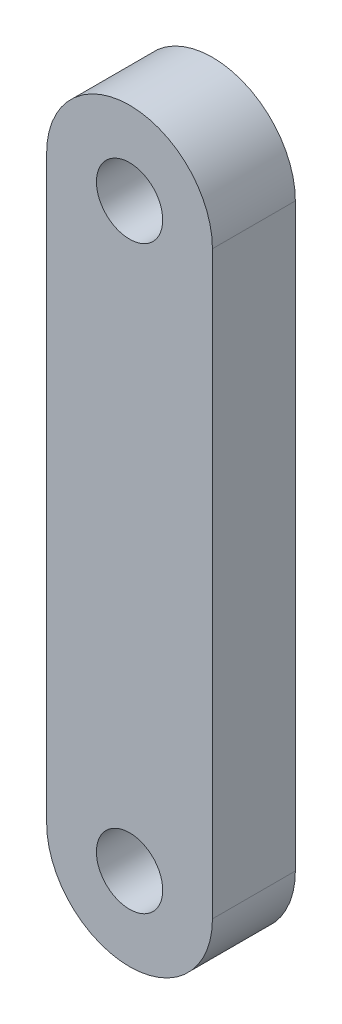
ISO-10303-21;
HEADER;
FILE_DESCRIPTION(('STEP AP214'),'2;1');
FILE_NAME('part.step','',(''),(''),'','','');
FILE_SCHEMA(('AUTOMOTIVE_DESIGN { 1 0 10303 214 1 1 1 1 }'));
ENDSEC;
DATA;
#1=APPLICATION_CONTEXT('core data for automotive mechanical design processes');
#2=APPLICATION_PROTOCOL_DEFINITION('international standard','automotive_design',2000,#1);
#3=PRODUCT_CONTEXT('',#1,'mechanical');
#4=PRODUCT('Part','Part','',(#3));
#5=PRODUCT_RELATED_PRODUCT_CATEGORY('part','',(#4));
#6=PRODUCT_DEFINITION_FORMATION('','',#4);
#7=PRODUCT_DEFINITION_CONTEXT('part definition',#1,'design');
#8=PRODUCT_DEFINITION('design','',#6,#7);
#9=PRODUCT_DEFINITION_SHAPE('','',#8);
#10=(LENGTH_UNIT() NAMED_UNIT(*) SI_UNIT(.MILLI.,.METRE.));
#11=(NAMED_UNIT(*) PLANE_ANGLE_UNIT() SI_UNIT($,.RADIAN.));
#12=(NAMED_UNIT(*) SI_UNIT($,.STERADIAN.) SOLID_ANGLE_UNIT());
#13=UNCERTAINTY_MEASURE_WITH_UNIT(LENGTH_MEASURE(1.E-05),#10,'distance_accuracy_value','');
#14=(GEOMETRIC_REPRESENTATION_CONTEXT(3) GLOBAL_UNCERTAINTY_ASSIGNED_CONTEXT((#13)) GLOBAL_UNIT_ASSIGNED_CONTEXT((#10,
#11,#12)) REPRESENTATION_CONTEXT('',''));
#15=CARTESIAN_POINT('',(0.,0.,0.));
#16=DIRECTION('',(0.,0.,1.));
#17=DIRECTION('',(1.,0.,0.));
#18=AXIS2_PLACEMENT_3D('',#15,#16,#17);
#19=CARTESIAN_POINT('',(0.,17.5,5.));
#20=DIRECTION('',(0.,0.,-1.));
#21=DIRECTION('',(-1.,0.,0.));
#22=AXIS2_PLACEMENT_3D('',#19,#20,#21);
#23=CYLINDRICAL_SURFACE('',#22,5.);
#24=CARTESIAN_POINT('',(0.,17.5,0.));
#25=DIRECTION('',(0.,0.,1.));
#26=DIRECTION('',(1.,0.,0.));
#27=AXIS2_PLACEMENT_3D('',#24,#25,#26);
#28=CIRCLE('',#27,5.);
#29=CARTESIAN_POINT('',(4.99999999999999,17.5,0.));
#30=VERTEX_POINT('',#29);
#31=CARTESIAN_POINT('',(-5.00000000000001,17.5,0.));
#32=VERTEX_POINT('',#31);
#33=EDGE_CURVE('E107',#30,#32,#28,.T.);
#34=ORIENTED_EDGE('',*,*,#33,.T.);
#35=DIRECTION('',(0.,0.,-1.));
#36=VECTOR('',#35,1.);
#37=CARTESIAN_POINT('',(-5.00000000000001,17.5,5.));
#38=LINE('',#37,#36);
#39=CARTESIAN_POINT('',(-5.00000000000001,17.5,5.));
#40=VERTEX_POINT('',#39);
#41=EDGE_CURVE('E11',#40,#32,#38,.T.);
#42=ORIENTED_EDGE('',*,*,#41,.F.);
#43=CARTESIAN_POINT('',(0.,17.5,5.));
#44=DIRECTION('',(0.,0.,1.));
#45=DIRECTION('',(1.,0.,0.));
#46=AXIS2_PLACEMENT_3D('',#43,#44,#45);
#47=CIRCLE('',#46,5.);
#48=CARTESIAN_POINT('',(4.99999999999999,17.5,5.));
#49=VERTEX_POINT('',#48);
#50=EDGE_CURVE('E91',#49,#40,#47,.T.);
#51=ORIENTED_EDGE('',*,*,#50,.F.);
#52=DIRECTION('',(0.,0.,-1.));
#53=VECTOR('',#52,1.);
#54=CARTESIAN_POINT('',(4.99999999999999,17.5,5.));
#55=LINE('',#54,#53);
#56=EDGE_CURVE('E103',#49,#30,#55,.T.);
#57=ORIENTED_EDGE('',*,*,#56,.T.);
#58=EDGE_LOOP('',(#34,#42,#51,#57));
#59=FACE_BOUND('',#58,.T.);
#60=ADVANCED_FACE('F39',(#59),#23,.T.);
#61=CARTESIAN_POINT('',(-5.00000000000001,17.5,5.));
#62=DIRECTION('',(1.,0.,0.));
#63=DIRECTION('',(0.,1.,0.));
#64=AXIS2_PLACEMENT_3D('',#61,#62,#63);
#65=PLANE('',#64);
#66=DIRECTION('',(0.,-1.,0.));
#67=VECTOR('',#66,1.);
#68=CARTESIAN_POINT('',(-5.00000000000001,17.5,0.));
#69=LINE('',#68,#67);
#70=CARTESIAN_POINT('',(-5.,-17.5,0.));
#71=VERTEX_POINT('',#70);
#72=EDGE_CURVE('E96',#32,#71,#69,.T.);
#73=ORIENTED_EDGE('',*,*,#72,.T.);
#74=DIRECTION('',(0.,0.,-1.));
#75=VECTOR('',#74,1.);
#76=CARTESIAN_POINT('',(-5.,-17.5,5.));
#77=LINE('',#76,#75);
#78=CARTESIAN_POINT('',(-5.,-17.5,5.));
#79=VERTEX_POINT('',#78);
#80=EDGE_CURVE('E48',#79,#71,#77,.T.);
#81=ORIENTED_EDGE('',*,*,#80,.F.);
#82=DIRECTION('',(0.,-1.,0.));
#83=VECTOR('',#82,1.);
#84=CARTESIAN_POINT('',(-5.00000000000001,17.5,5.));
#85=LINE('',#84,#83);
#86=EDGE_CURVE('E86',#40,#79,#85,.T.);
#87=ORIENTED_EDGE('',*,*,#86,.F.);
#88=ORIENTED_EDGE('',*,*,#41,.T.);
#89=EDGE_LOOP('',(#73,#81,#87,#88));
#90=FACE_BOUND('',#89,.T.);
#91=ADVANCED_FACE('F95',(#90),#65,.F.);
#92=CARTESIAN_POINT('',(0.,-17.5,5.));
#93=DIRECTION('',(0.,0.,-1.));
#94=DIRECTION('',(-1.,0.,0.));
#95=AXIS2_PLACEMENT_3D('',#92,#93,#94);
#96=CYLINDRICAL_SURFACE('',#95,5.);
#97=CARTESIAN_POINT('',(0.,-17.5,0.));
#98=DIRECTION('',(0.,0.,1.));
#99=DIRECTION('',(1.,0.,0.));
#100=AXIS2_PLACEMENT_3D('',#97,#98,#99);
#101=CIRCLE('',#100,5.);
#102=CARTESIAN_POINT('',(5.,-17.5,0.));
#103=VERTEX_POINT('',#102);
#104=EDGE_CURVE('E73',#71,#103,#101,.T.);
#105=ORIENTED_EDGE('',*,*,#104,.T.);
#106=DIRECTION('',(0.,0.,-1.));
#107=VECTOR('',#106,1.);
#108=CARTESIAN_POINT('',(5.,-17.5,5.));
#109=LINE('',#108,#107);
#110=CARTESIAN_POINT('',(5.,-17.5,5.));
#111=VERTEX_POINT('',#110);
#112=EDGE_CURVE('E98',#111,#103,#109,.T.);
#113=ORIENTED_EDGE('',*,*,#112,.F.);
#114=CARTESIAN_POINT('',(0.,-17.5,5.));
#115=DIRECTION('',(0.,0.,1.));
#116=DIRECTION('',(1.,0.,0.));
#117=AXIS2_PLACEMENT_3D('',#114,#115,#116);
#118=CIRCLE('',#117,5.);
#119=EDGE_CURVE('E89',#79,#111,#118,.T.);
#120=ORIENTED_EDGE('',*,*,#119,.F.);
#121=ORIENTED_EDGE('',*,*,#80,.T.);
#122=EDGE_LOOP('',(#105,#113,#120,#121));
#123=FACE_BOUND('',#122,.T.);
#124=ADVANCED_FACE('F99',(#123),#96,.T.);
#125=CARTESIAN_POINT('',(4.99999999999999,17.5,5.));
#126=DIRECTION('',(-1.,0.,0.));
#127=DIRECTION('',(0.,-1.,0.));
#128=AXIS2_PLACEMENT_3D('',#125,#126,#127);
#129=PLANE('',#128);
#130=DIRECTION('',(0.,1.,0.));
#131=VECTOR('',#130,1.);
#132=CARTESIAN_POINT('',(4.99999999999999,17.5,0.));
#133=LINE('',#132,#131);
#134=EDGE_CURVE('E79',#103,#30,#133,.T.);
#135=ORIENTED_EDGE('',*,*,#134,.T.);
#136=ORIENTED_EDGE('',*,*,#56,.F.);
#137=DIRECTION('',(0.,1.,0.));
#138=VECTOR('',#137,1.);
#139=CARTESIAN_POINT('',(4.99999999999999,17.5,5.));
#140=LINE('',#139,#138);
#141=EDGE_CURVE('E56',#111,#49,#140,.T.);
#142=ORIENTED_EDGE('',*,*,#141,.F.);
#143=ORIENTED_EDGE('',*,*,#112,.T.);
#144=EDGE_LOOP('',(#135,#136,#142,#143));
#145=FACE_BOUND('',#144,.T.);
#146=ADVANCED_FACE('F121',(#145),#129,.F.);
#147=CARTESIAN_POINT('',(0.,17.5,5.));
#148=DIRECTION('',(0.,0.,1.));
#149=DIRECTION('',(1.,0.,0.));
#150=AXIS2_PLACEMENT_3D('',#147,#148,#149);
#151=PLANE('',#150);
#152=CARTESIAN_POINT('',(0.,17.5,5.));
#153=DIRECTION('',(0.,0.,1.));
#154=DIRECTION('',(1.,0.,0.));
#155=AXIS2_PLACEMENT_3D('',#152,#153,#154);
#156=CIRCLE('',#155,2.);
#157=CARTESIAN_POINT('',(1.99999999999999,17.5,5.));
#158=VERTEX_POINT('',#157);
#159=EDGE_CURVE('E139',#158,#158,#156,.T.);
#160=ORIENTED_EDGE('',*,*,#159,.F.);
#161=EDGE_LOOP('',(#160));
#162=FACE_BOUND('',#161,.T.);
#163=CARTESIAN_POINT('',(0.,-17.5,5.));
#164=DIRECTION('',(0.,0.,1.));
#165=DIRECTION('',(1.,0.,0.));
#166=AXIS2_PLACEMENT_3D('',#163,#164,#165);
#167=CIRCLE('',#166,2.);
#168=CARTESIAN_POINT('',(2.,-17.5,5.));
#169=VERTEX_POINT('',#168);
#170=EDGE_CURVE('E131',#169,#169,#167,.T.);
#171=ORIENTED_EDGE('',*,*,#170,.F.);
#172=EDGE_LOOP('',(#171));
#173=FACE_BOUND('',#172,.T.);
#174=ORIENTED_EDGE('',*,*,#50,.T.);
#175=ORIENTED_EDGE('',*,*,#86,.T.);
#176=ORIENTED_EDGE('',*,*,#119,.T.);
#177=ORIENTED_EDGE('',*,*,#141,.T.);
#178=EDGE_LOOP('',(#174,#175,#176,#177));
#179=FACE_BOUND('',#178,.T.);
#180=ADVANCED_FACE('F87',(#162,#173,#179),#151,.T.);
#181=CARTESIAN_POINT('',(0.,17.5,0.));
#182=DIRECTION('',(0.,0.,1.));
#183=DIRECTION('',(1.,0.,0.));
#184=AXIS2_PLACEMENT_3D('',#181,#182,#183);
#185=PLANE('',#184);
#186=CARTESIAN_POINT('',(0.,17.5,0.));
#187=DIRECTION('',(0.,0.,1.));
#188=DIRECTION('',(1.,0.,0.));
#189=AXIS2_PLACEMENT_3D('',#186,#187,#188);
#190=CIRCLE('',#189,2.);
#191=CARTESIAN_POINT('',(1.99999999999999,17.5,0.));
#192=VERTEX_POINT('',#191);
#193=EDGE_CURVE('E135',#192,#192,#190,.T.);
#194=ORIENTED_EDGE('',*,*,#193,.T.);
#195=EDGE_LOOP('',(#194));
#196=FACE_BOUND('',#195,.T.);
#197=CARTESIAN_POINT('',(0.,-17.5,0.));
#198=DIRECTION('',(0.,0.,1.));
#199=DIRECTION('',(1.,0.,0.));
#200=AXIS2_PLACEMENT_3D('',#197,#198,#199);
#201=CIRCLE('',#200,2.);
#202=CARTESIAN_POINT('',(2.,-17.5,0.));
#203=VERTEX_POINT('',#202);
#204=EDGE_CURVE('E111',#203,#203,#201,.T.);
#205=ORIENTED_EDGE('',*,*,#204,.T.);
#206=EDGE_LOOP('',(#205));
#207=FACE_BOUND('',#206,.T.);
#208=ORIENTED_EDGE('',*,*,#33,.F.);
#209=ORIENTED_EDGE('',*,*,#134,.F.);
#210=ORIENTED_EDGE('',*,*,#104,.F.);
#211=ORIENTED_EDGE('',*,*,#72,.F.);
#212=EDGE_LOOP('',(#208,#209,#210,#211));
#213=FACE_BOUND('',#212,.T.);
#214=ADVANCED_FACE('F124',(#196,#207,#213),#185,.F.);
#215=CARTESIAN_POINT('',(0.,-17.5,5.));
#216=DIRECTION('',(0.,0.,1.));
#217=DIRECTION('',(1.,0.,0.));
#218=AXIS2_PLACEMENT_3D('',#215,#216,#217);
#219=CYLINDRICAL_SURFACE('',#218,2.);
#220=ORIENTED_EDGE('',*,*,#204,.F.);
#221=EDGE_LOOP('',(#220));
#222=FACE_BOUND('',#221,.T.);
#223=ORIENTED_EDGE('',*,*,#170,.T.);
#224=EDGE_LOOP('',(#223));
#225=FACE_BOUND('',#224,.T.);
#226=ADVANCED_FACE('F151',(#222,#225),#219,.F.);
#227=CARTESIAN_POINT('',(0.,17.5,5.));
#228=DIRECTION('',(0.,0.,1.));
#229=DIRECTION('',(1.,0.,0.));
#230=AXIS2_PLACEMENT_3D('',#227,#228,#229);
#231=CYLINDRICAL_SURFACE('',#230,2.);
#232=ORIENTED_EDGE('',*,*,#193,.F.);
#233=EDGE_LOOP('',(#232));
#234=FACE_BOUND('',#233,.T.);
#235=ORIENTED_EDGE('',*,*,#159,.T.);
#236=EDGE_LOOP('',(#235));
#237=FACE_BOUND('',#236,.T.);
#238=ADVANCED_FACE('F144',(#234,#237),#231,.F.);
#239=CLOSED_SHELL('',(#60,#91,#124,#146,#180,#214,#226,#238));
#240=MANIFOLD_SOLID_BREP('B2',#239);
#241=ADVANCED_BREP_SHAPE_REPRESENTATION('',(#18,#240),#14);
#242=SHAPE_DEFINITION_REPRESENTATION(#9,#241);
ENDSEC;
END-ISO-10303-21;
